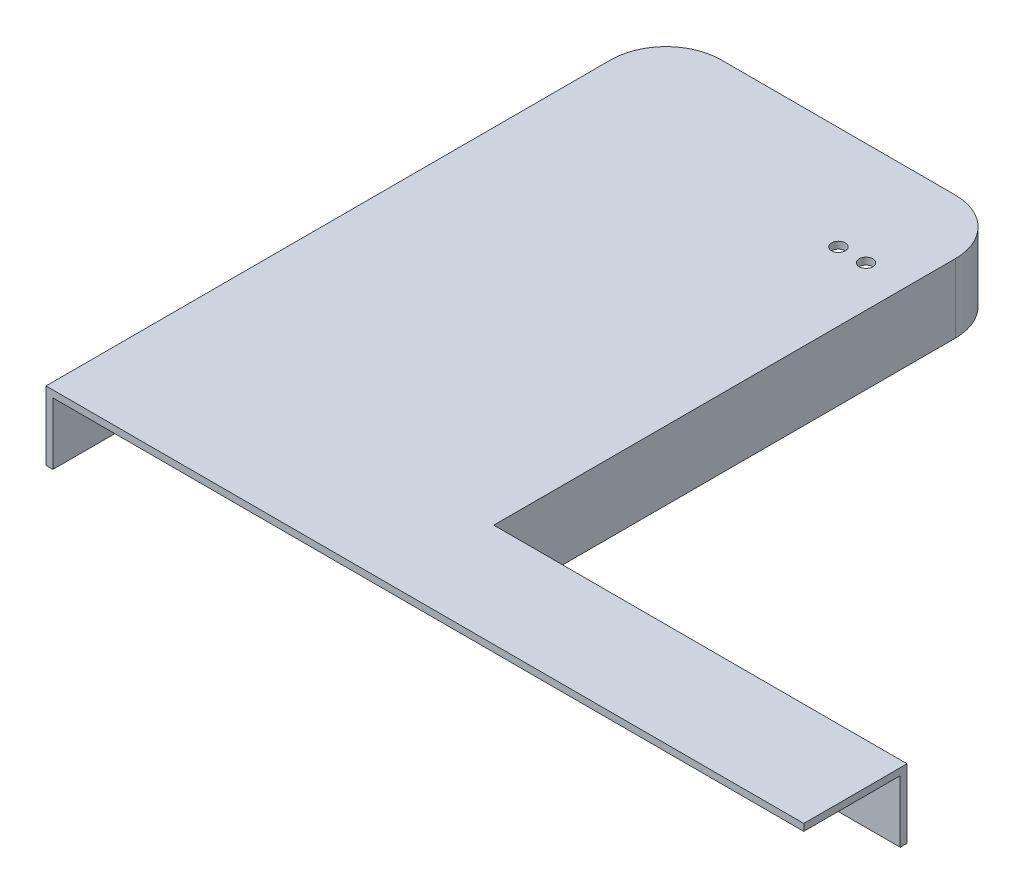
ISO-10303-21;
HEADER;
FILE_DESCRIPTION(('STEP AP214'),'2;1');
FILE_NAME('part.step','',(''),(''),'','','');
FILE_SCHEMA(('AUTOMOTIVE_DESIGN { 1 0 10303 214 1 1 1 1 }'));
ENDSEC;
DATA;
#1=APPLICATION_CONTEXT('core data for automotive mechanical design processes');
#2=APPLICATION_PROTOCOL_DEFINITION('international standard','automotive_design',2000,#1);
#3=PRODUCT_CONTEXT('',#1,'mechanical');
#4=PRODUCT('Part','Part','',(#3));
#5=PRODUCT_RELATED_PRODUCT_CATEGORY('part','',(#4));
#6=PRODUCT_DEFINITION_FORMATION('','',#4);
#7=PRODUCT_DEFINITION_CONTEXT('part definition',#1,'design');
#8=PRODUCT_DEFINITION('design','',#6,#7);
#9=PRODUCT_DEFINITION_SHAPE('','',#8);
#10=(LENGTH_UNIT() NAMED_UNIT(*) SI_UNIT(.MILLI.,.METRE.));
#11=(NAMED_UNIT(*) PLANE_ANGLE_UNIT() SI_UNIT($,.RADIAN.));
#12=(NAMED_UNIT(*) SI_UNIT($,.STERADIAN.) SOLID_ANGLE_UNIT());
#13=UNCERTAINTY_MEASURE_WITH_UNIT(LENGTH_MEASURE(1.E-05),#10,'distance_accuracy_value','');
#14=(GEOMETRIC_REPRESENTATION_CONTEXT(3) GLOBAL_UNCERTAINTY_ASSIGNED_CONTEXT((#13)) GLOBAL_UNIT_ASSIGNED_CONTEXT((#10,
#11,#12)) REPRESENTATION_CONTEXT('',''));
#15=CARTESIAN_POINT('',(0.,0.,0.));
#16=DIRECTION('',(0.,0.,1.));
#17=DIRECTION('',(1.,0.,0.));
#18=AXIS2_PLACEMENT_3D('',#15,#16,#17);
#19=CARTESIAN_POINT('',(0.,25.4,-12.7));
#20=DIRECTION('',(0.,0.,-1.));
#21=DIRECTION('',(-1.,0.,0.));
#22=AXIS2_PLACEMENT_3D('',#19,#20,#21);
#23=PLANE('',#22);
#24=DIRECTION('',(1.,0.,0.));
#25=VECTOR('',#24,1.);
#26=CARTESIAN_POINT('',(0.,25.4,-12.7));
#27=LINE('',#26,#25);
#28=CARTESIAN_POINT('',(-152.4,25.4,-12.7));
#29=VERTEX_POINT('',#28);
#30=CARTESIAN_POINT('',(0.,25.4,-12.7));
#31=VERTEX_POINT('',#30);
#32=EDGE_CURVE('E169',#29,#31,#27,.T.);
#33=ORIENTED_EDGE('',*,*,#32,.T.);
#34=DIRECTION('',(0.,-1.,0.));
#35=VECTOR('',#34,1.);
#36=CARTESIAN_POINT('',(0.,25.4,-12.7));
#37=LINE('',#36,#35);
#38=CARTESIAN_POINT('',(0.,0.,-12.7));
#39=VERTEX_POINT('',#38);
#40=EDGE_CURVE('E322',#31,#39,#37,.T.);
#41=ORIENTED_EDGE('',*,*,#40,.T.);
#42=DIRECTION('',(1.,0.,0.));
#43=VECTOR('',#42,1.);
#44=CARTESIAN_POINT('',(0.,0.,-12.7));
#45=LINE('',#44,#43);
#46=CARTESIAN_POINT('',(-152.4,0.,-12.7));
#47=VERTEX_POINT('',#46);
#48=EDGE_CURVE('E280',#47,#39,#45,.T.);
#49=ORIENTED_EDGE('',*,*,#48,.F.);
#50=DIRECTION('',(0.,-1.,0.));
#51=VECTOR('',#50,1.);
#52=CARTESIAN_POINT('',(-152.4,25.4,-12.7));
#53=LINE('',#52,#51);
#54=EDGE_CURVE('E183',#29,#47,#53,.T.);
#55=ORIENTED_EDGE('',*,*,#54,.F.);
#56=EDGE_LOOP('',(#33,#41,#49,#55));
#57=FACE_BOUND('',#56,.T.);
#58=ADVANCED_FACE('F40',(#57),#23,.T.);
#59=CARTESIAN_POINT('',(0.,25.4,0.));
#60=DIRECTION('',(0.,1.,0.));
#61=DIRECTION('',(0.,0.,1.));
#62=AXIS2_PLACEMENT_3D('',#59,#60,#61);
#63=PLANE('',#62);
#64=DIRECTION('',(-1.,0.,0.));
#65=VECTOR('',#64,1.);
#66=CARTESIAN_POINT('',(0.,25.4,25.4));
#67=LINE('',#66,#65);
#68=CARTESIAN_POINT('',(0.,25.4,25.4));
#69=VERTEX_POINT('',#68);
#70=CARTESIAN_POINT('',(-279.4,25.4,25.4));
#71=VERTEX_POINT('',#70);
#72=EDGE_CURVE('E152',#69,#71,#67,.T.);
#73=ORIENTED_EDGE('',*,*,#72,.F.);
#74=DIRECTION('',(0.,0.,1.));
#75=VECTOR('',#74,1.);
#76=CARTESIAN_POINT('',(0.,25.4,203.2));
#77=LINE('',#76,#75);
#78=EDGE_CURVE('E239',#31,#69,#77,.T.);
#79=ORIENTED_EDGE('',*,*,#78,.F.);
#80=ORIENTED_EDGE('',*,*,#32,.F.);
#81=DIRECTION('',(0.,0.,1.));
#82=VECTOR('',#81,1.);
#83=CARTESIAN_POINT('',(-152.4,25.4,0.));
#84=LINE('',#83,#82);
#85=CARTESIAN_POINT('',(-152.4,25.4,-182.88));
#86=VERTEX_POINT('',#85);
#87=EDGE_CURVE('E175',#86,#29,#84,.T.);
#88=ORIENTED_EDGE('',*,*,#87,.F.);
#89=CARTESIAN_POINT('',(-172.72,25.4,-182.88));
#90=DIRECTION('',(0.,1.,0.));
#91=DIRECTION('',(0.,0.,1.));
#92=AXIS2_PLACEMENT_3D('',#89,#90,#91);
#93=CIRCLE('',#92,20.32);
#94=CARTESIAN_POINT('',(-172.72,25.4,-203.2));
#95=VERTEX_POINT('',#94);
#96=EDGE_CURVE('E193',#86,#95,#93,.T.);
#97=ORIENTED_EDGE('',*,*,#96,.T.);
#98=DIRECTION('',(1.,0.,0.));
#99=VECTOR('',#98,1.);
#100=CARTESIAN_POINT('',(0.,25.4,-203.2));
#101=LINE('',#100,#99);
#102=CARTESIAN_POINT('',(-259.08,25.4,-203.2));
#103=VERTEX_POINT('',#102);
#104=EDGE_CURVE('E302',#103,#95,#101,.T.);
#105=ORIENTED_EDGE('',*,*,#104,.F.);
#106=CARTESIAN_POINT('',(-259.08,25.4,-182.88));
#107=DIRECTION('',(0.,1.,0.));
#108=DIRECTION('',(0.,0.,1.));
#109=AXIS2_PLACEMENT_3D('',#106,#107,#108);
#110=CIRCLE('',#109,20.32);
#111=CARTESIAN_POINT('',(-279.4,25.4,-182.88));
#112=VERTEX_POINT('',#111);
#113=EDGE_CURVE('E196',#103,#112,#110,.T.);
#114=ORIENTED_EDGE('',*,*,#113,.T.);
#115=DIRECTION('',(0.,0.,-1.));
#116=VECTOR('',#115,1.);
#117=CARTESIAN_POINT('',(-279.4,25.4,0.));
#118=LINE('',#117,#116);
#119=EDGE_CURVE('E63',#71,#112,#118,.T.);
#120=ORIENTED_EDGE('',*,*,#119,.F.);
#121=EDGE_LOOP('',(#73,#79,#80,#88,#97,#105,#114,#120));
#122=FACE_BOUND('',#121,.T.);
#123=CARTESIAN_POINT('',(-167.56,25.4,-165.1));
#124=DIRECTION('',(0.,1.,0.));
#125=DIRECTION('',(0.,0.,1.));
#126=AXIS2_PLACEMENT_3D('',#123,#124,#125);
#127=CIRCLE('',#126,2.53999999999998);
#128=CARTESIAN_POINT('',(-167.56,25.4,-162.56));
#129=VERTEX_POINT('',#128);
#130=EDGE_CURVE('E255',#129,#129,#127,.T.);
#131=ORIENTED_EDGE('',*,*,#130,.F.);
#132=EDGE_LOOP('',(#131));
#133=FACE_BOUND('',#132,.T.);
#134=CARTESIAN_POINT('',(-177.72,25.4,-165.1));
#135=DIRECTION('',(0.,1.,0.));
#136=DIRECTION('',(0.,0.,1.));
#137=AXIS2_PLACEMENT_3D('',#134,#135,#136);
#138=CIRCLE('',#137,2.53999999999998);
#139=CARTESIAN_POINT('',(-177.72,25.4,-162.56));
#140=VERTEX_POINT('',#139);
#141=EDGE_CURVE('E216',#140,#140,#138,.T.);
#142=ORIENTED_EDGE('',*,*,#141,.F.);
#143=EDGE_LOOP('',(#142));
#144=FACE_BOUND('',#143,.T.);
#145=ADVANCED_FACE('F337',(#122,#133,#144),#63,.T.);
#146=CARTESIAN_POINT('',(0.,0.,0.));
#147=DIRECTION('',(0.,1.,0.));
#148=DIRECTION('',(0.,0.,1.));
#149=AXIS2_PLACEMENT_3D('',#146,#147,#148);
#150=PLANE('',#149);
#151=DIRECTION('',(0.,0.,-1.));
#152=VECTOR('',#151,1.);
#153=CARTESIAN_POINT('',(-276.86,0.,0.));
#154=LINE('',#153,#152);
#155=CARTESIAN_POINT('',(-276.86,0.,25.4));
#156=VERTEX_POINT('',#155);
#157=CARTESIAN_POINT('',(-276.86,0.,-182.88));
#158=VERTEX_POINT('',#157);
#159=EDGE_CURVE('E162',#156,#158,#154,.T.);
#160=ORIENTED_EDGE('',*,*,#159,.F.);
#161=DIRECTION('',(1.,0.,0.));
#162=VECTOR('',#161,1.);
#163=CARTESIAN_POINT('',(-279.4,0.,25.4));
#164=LINE('',#163,#162);
#165=CARTESIAN_POINT('',(-279.4,0.,25.4));
#166=VERTEX_POINT('',#165);
#167=EDGE_CURVE('E149',#166,#156,#164,.T.);
#168=ORIENTED_EDGE('',*,*,#167,.F.);
#169=DIRECTION('',(0.,0.,-1.));
#170=VECTOR('',#169,1.);
#171=CARTESIAN_POINT('',(-279.4,0.,0.));
#172=LINE('',#171,#170);
#173=CARTESIAN_POINT('',(-279.4,0.,-182.88));
#174=VERTEX_POINT('',#173);
#175=EDGE_CURVE('E159',#166,#174,#172,.T.);
#176=ORIENTED_EDGE('',*,*,#175,.T.);
#177=CARTESIAN_POINT('',(-259.08,0.,-182.88));
#178=DIRECTION('',(0.,1.,0.));
#179=DIRECTION('',(0.,0.,1.));
#180=AXIS2_PLACEMENT_3D('',#177,#178,#179);
#181=CIRCLE('',#180,20.32);
#182=CARTESIAN_POINT('',(-259.08,0.,-203.2));
#183=VERTEX_POINT('',#182);
#184=EDGE_CURVE('E190',#174,#183,#181,.F.);
#185=ORIENTED_EDGE('',*,*,#184,.T.);
#186=DIRECTION('',(1.,0.,0.));
#187=VECTOR('',#186,1.);
#188=CARTESIAN_POINT('',(0.,0.,-203.2));
#189=LINE('',#188,#187);
#190=CARTESIAN_POINT('',(-172.72,0.,-203.2));
#191=VERTEX_POINT('',#190);
#192=EDGE_CURVE('E170',#183,#191,#189,.T.);
#193=ORIENTED_EDGE('',*,*,#192,.T.);
#194=CARTESIAN_POINT('',(-172.72,0.,-182.88));
#195=DIRECTION('',(0.,1.,0.));
#196=DIRECTION('',(0.,0.,1.));
#197=AXIS2_PLACEMENT_3D('',#194,#195,#196);
#198=CIRCLE('',#197,20.32);
#199=CARTESIAN_POINT('',(-152.4,0.,-182.88));
#200=VERTEX_POINT('',#199);
#201=EDGE_CURVE('E187',#191,#200,#198,.F.);
#202=ORIENTED_EDGE('',*,*,#201,.T.);
#203=DIRECTION('',(0.,0.,1.));
#204=VECTOR('',#203,1.);
#205=CARTESIAN_POINT('',(-152.4,0.,0.));
#206=LINE('',#205,#204);
#207=EDGE_CURVE('E178',#200,#47,#206,.T.);
#208=ORIENTED_EDGE('',*,*,#207,.T.);
#209=ORIENTED_EDGE('',*,*,#48,.T.);
#210=DIRECTION('',(0.,0.,-1.));
#211=VECTOR('',#210,1.);
#212=CARTESIAN_POINT('',(0.,0.,0.));
#213=LINE('',#212,#211);
#214=CARTESIAN_POINT('',(0.,0.,-10.16));
#215=VERTEX_POINT('',#214);
#216=EDGE_CURVE('E238',#215,#39,#213,.T.);
#217=ORIENTED_EDGE('',*,*,#216,.F.);
#218=DIRECTION('',(1.,0.,0.));
#219=VECTOR('',#218,1.);
#220=CARTESIAN_POINT('',(0.,0.,-10.16));
#221=LINE('',#220,#219);
#222=CARTESIAN_POINT('',(-154.94,0.,-10.16));
#223=VERTEX_POINT('',#222);
#224=EDGE_CURVE('E219',#223,#215,#221,.T.);
#225=ORIENTED_EDGE('',*,*,#224,.F.);
#226=DIRECTION('',(0.,0.,1.));
#227=VECTOR('',#226,1.);
#228=CARTESIAN_POINT('',(-154.94,0.,0.));
#229=LINE('',#228,#227);
#230=CARTESIAN_POINT('',(-154.94,0.,-182.88));
#231=VERTEX_POINT('',#230);
#232=EDGE_CURVE('E295',#231,#223,#229,.T.);
#233=ORIENTED_EDGE('',*,*,#232,.F.);
#234=CARTESIAN_POINT('',(-172.72,0.,-182.88));
#235=DIRECTION('',(0.,1.,0.));
#236=DIRECTION('',(0.,0.,1.));
#237=AXIS2_PLACEMENT_3D('',#234,#235,#236);
#238=CIRCLE('',#237,17.78);
#239=CARTESIAN_POINT('',(-172.72,0.,-200.66));
#240=VERTEX_POINT('',#239);
#241=EDGE_CURVE('E276',#240,#231,#238,.F.);
#242=ORIENTED_EDGE('',*,*,#241,.F.);
#243=DIRECTION('',(1.,0.,0.));
#244=VECTOR('',#243,1.);
#245=CARTESIAN_POINT('',(0.,0.,-200.66));
#246=LINE('',#245,#244);
#247=CARTESIAN_POINT('',(-259.08,0.,-200.66));
#248=VERTEX_POINT('',#247);
#249=EDGE_CURVE('E252',#248,#240,#246,.T.);
#250=ORIENTED_EDGE('',*,*,#249,.F.);
#251=CARTESIAN_POINT('',(-259.08,0.,-182.88));
#252=DIRECTION('',(0.,1.,0.));
#253=DIRECTION('',(0.,0.,1.));
#254=AXIS2_PLACEMENT_3D('',#251,#252,#253);
#255=CIRCLE('',#254,17.78);
#256=EDGE_CURVE('E262',#158,#248,#255,.F.);
#257=ORIENTED_EDGE('',*,*,#256,.F.);
#258=EDGE_LOOP('',(#160,#168,#176,#185,#193,#202,#208,#209,#217,#225,#233,#242,#250,#257));
#259=FACE_BOUND('',#258,.T.);
#260=ADVANCED_FACE('F158',(#259),#150,.F.);
#261=CARTESIAN_POINT('',(0.,25.4,-10.16));
#262=DIRECTION('',(0.,0.,-1.));
#263=DIRECTION('',(-1.,0.,0.));
#264=AXIS2_PLACEMENT_3D('',#261,#262,#263);
#265=PLANE('',#264);
#266=DIRECTION('',(0.,-1.,0.));
#267=VECTOR('',#266,1.);
#268=CARTESIAN_POINT('',(0.,25.4,-10.16));
#269=LINE('',#268,#267);
#270=CARTESIAN_POINT('',(0.,22.86,-10.16));
#271=VERTEX_POINT('',#270);
#272=EDGE_CURVE('E225',#271,#215,#269,.T.);
#273=ORIENTED_EDGE('',*,*,#272,.F.);
#274=DIRECTION('',(1.,0.,0.));
#275=VECTOR('',#274,1.);
#276=CARTESIAN_POINT('',(0.,22.86,-10.16));
#277=LINE('',#276,#275);
#278=CARTESIAN_POINT('',(-154.94,22.86,-10.16));
#279=VERTEX_POINT('',#278);
#280=EDGE_CURVE('E235',#279,#271,#277,.T.);
#281=ORIENTED_EDGE('',*,*,#280,.F.);
#282=DIRECTION('',(0.,-1.,0.));
#283=VECTOR('',#282,1.);
#284=CARTESIAN_POINT('',(-154.94,25.4,-10.16));
#285=LINE('',#284,#283);
#286=EDGE_CURVE('E273',#279,#223,#285,.T.);
#287=ORIENTED_EDGE('',*,*,#286,.T.);
#288=ORIENTED_EDGE('',*,*,#224,.T.);
#289=EDGE_LOOP('',(#273,#281,#287,#288));
#290=FACE_BOUND('',#289,.T.);
#291=ADVANCED_FACE('F233',(#290),#265,.F.);
#292=CARTESIAN_POINT('',(0.,22.86,0.));
#293=DIRECTION('',(0.,1.,0.));
#294=DIRECTION('',(0.,0.,1.));
#295=AXIS2_PLACEMENT_3D('',#292,#293,#294);
#296=PLANE('',#295);
#297=CARTESIAN_POINT('',(-167.56,22.86,-165.1));
#298=DIRECTION('',(0.,1.,0.));
#299=DIRECTION('',(0.,0.,1.));
#300=AXIS2_PLACEMENT_3D('',#297,#298,#299);
#301=CIRCLE('',#300,2.53999999999998);
#302=CARTESIAN_POINT('',(-167.56,22.86,-162.56));
#303=VERTEX_POINT('',#302);
#304=EDGE_CURVE('E211',#303,#303,#301,.T.);
#305=ORIENTED_EDGE('',*,*,#304,.T.);
#306=EDGE_LOOP('',(#305));
#307=FACE_BOUND('',#306,.T.);
#308=CARTESIAN_POINT('',(-177.72,22.86,-165.1));
#309=DIRECTION('',(0.,1.,0.));
#310=DIRECTION('',(0.,0.,1.));
#311=AXIS2_PLACEMENT_3D('',#308,#309,#310);
#312=CIRCLE('',#311,2.53999999999998);
#313=CARTESIAN_POINT('',(-177.72,22.86,-162.56));
#314=VERTEX_POINT('',#313);
#315=EDGE_CURVE('E215',#314,#314,#312,.T.);
#316=ORIENTED_EDGE('',*,*,#315,.T.);
#317=EDGE_LOOP('',(#316));
#318=FACE_BOUND('',#317,.T.);
#319=DIRECTION('',(0.,0.,-1.));
#320=VECTOR('',#319,1.);
#321=CARTESIAN_POINT('',(0.,22.86,0.));
#322=LINE('',#321,#320);
#323=CARTESIAN_POINT('',(0.,22.86,25.4));
#324=VERTEX_POINT('',#323);
#325=EDGE_CURVE('E49',#324,#271,#322,.T.);
#326=ORIENTED_EDGE('',*,*,#325,.F.);
#327=DIRECTION('',(-1.,0.,0.));
#328=VECTOR('',#327,1.);
#329=CARTESIAN_POINT('',(0.,22.86,25.4));
#330=LINE('',#329,#328);
#331=CARTESIAN_POINT('',(-276.86,22.86,25.4));
#332=VERTEX_POINT('',#331);
#333=EDGE_CURVE('E55',#324,#332,#330,.T.);
#334=ORIENTED_EDGE('',*,*,#333,.T.);
#335=DIRECTION('',(0.,0.,-1.));
#336=VECTOR('',#335,1.);
#337=CARTESIAN_POINT('',(-276.86,22.86,0.));
#338=LINE('',#337,#336);
#339=CARTESIAN_POINT('',(-276.86,22.86,-182.88));
#340=VERTEX_POINT('',#339);
#341=EDGE_CURVE('E266',#332,#340,#338,.T.);
#342=ORIENTED_EDGE('',*,*,#341,.T.);
#343=CARTESIAN_POINT('',(-259.08,22.86,-182.88));
#344=DIRECTION('',(0.,1.,0.));
#345=DIRECTION('',(0.,0.,1.));
#346=AXIS2_PLACEMENT_3D('',#343,#344,#345);
#347=CIRCLE('',#346,17.78);
#348=CARTESIAN_POINT('',(-259.08,22.86,-200.66));
#349=VERTEX_POINT('',#348);
#350=EDGE_CURVE('E261',#349,#340,#347,.T.);
#351=ORIENTED_EDGE('',*,*,#350,.F.);
#352=DIRECTION('',(1.,0.,0.));
#353=VECTOR('',#352,1.);
#354=CARTESIAN_POINT('',(0.,22.86,-200.66));
#355=LINE('',#354,#353);
#356=CARTESIAN_POINT('',(-172.72,22.86,-200.66));
#357=VERTEX_POINT('',#356);
#358=EDGE_CURVE('E250',#349,#357,#355,.T.);
#359=ORIENTED_EDGE('',*,*,#358,.T.);
#360=CARTESIAN_POINT('',(-172.72,22.86,-182.88));
#361=DIRECTION('',(0.,1.,0.));
#362=DIRECTION('',(0.,0.,1.));
#363=AXIS2_PLACEMENT_3D('',#360,#361,#362);
#364=CIRCLE('',#363,17.78);
#365=CARTESIAN_POINT('',(-154.94,22.86,-182.88));
#366=VERTEX_POINT('',#365);
#367=EDGE_CURVE('E258',#366,#357,#364,.T.);
#368=ORIENTED_EDGE('',*,*,#367,.F.);
#369=DIRECTION('',(0.,0.,1.));
#370=VECTOR('',#369,1.);
#371=CARTESIAN_POINT('',(-154.94,22.86,0.));
#372=LINE('',#371,#370);
#373=EDGE_CURVE('E244',#366,#279,#372,.T.);
#374=ORIENTED_EDGE('',*,*,#373,.T.);
#375=ORIENTED_EDGE('',*,*,#280,.T.);
#376=EDGE_LOOP('',(#326,#334,#342,#351,#359,#368,#374,#375));
#377=FACE_BOUND('',#376,.T.);
#378=ADVANCED_FACE('F241',(#307,#318,#377),#296,.F.);
#379=CARTESIAN_POINT('',(-152.4,25.4,0.));
#380=DIRECTION('',(1.,0.,0.));
#381=DIRECTION('',(0.,0.,-1.));
#382=AXIS2_PLACEMENT_3D('',#379,#380,#381);
#383=PLANE('',#382);
#384=ORIENTED_EDGE('',*,*,#207,.F.);
#385=DIRECTION('',(0.,-1.,0.));
#386=VECTOR('',#385,1.);
#387=CARTESIAN_POINT('',(-152.4,25.4,-182.88));
#388=LINE('',#387,#386);
#389=EDGE_CURVE('E208',#200,#86,#388,.F.);
#390=ORIENTED_EDGE('',*,*,#389,.T.);
#391=ORIENTED_EDGE('',*,*,#87,.T.);
#392=ORIENTED_EDGE('',*,*,#54,.T.);
#393=EDGE_LOOP('',(#384,#390,#391,#392));
#394=FACE_BOUND('',#393,.T.);
#395=ADVANCED_FACE('F317',(#394),#383,.T.);
#396=CARTESIAN_POINT('',(0.,25.4,-203.2));
#397=DIRECTION('',(0.,0.,-1.));
#398=DIRECTION('',(-1.,0.,0.));
#399=AXIS2_PLACEMENT_3D('',#396,#397,#398);
#400=PLANE('',#399);
#401=ORIENTED_EDGE('',*,*,#192,.F.);
#402=DIRECTION('',(0.,-1.,0.));
#403=VECTOR('',#402,1.);
#404=CARTESIAN_POINT('',(-259.08,25.4,-203.2));
#405=LINE('',#404,#403);
#406=EDGE_CURVE('E205',#183,#103,#405,.F.);
#407=ORIENTED_EDGE('',*,*,#406,.T.);
#408=ORIENTED_EDGE('',*,*,#104,.T.);
#409=DIRECTION('',(0.,-1.,0.));
#410=VECTOR('',#409,1.);
#411=CARTESIAN_POINT('',(-172.72,25.4,-203.2));
#412=LINE('',#411,#410);
#413=EDGE_CURVE('E201',#95,#191,#412,.T.);
#414=ORIENTED_EDGE('',*,*,#413,.T.);
#415=EDGE_LOOP('',(#401,#407,#408,#414));
#416=FACE_BOUND('',#415,.T.);
#417=ADVANCED_FACE('F356',(#416),#400,.T.);
#418=CARTESIAN_POINT('',(-279.4,25.4,0.));
#419=DIRECTION('',(-1.,0.,0.));
#420=DIRECTION('',(0.,0.,1.));
#421=AXIS2_PLACEMENT_3D('',#418,#419,#420);
#422=PLANE('',#421);
#423=DIRECTION('',(0.,-1.,0.));
#424=VECTOR('',#423,1.);
#425=CARTESIAN_POINT('',(-279.4,0.,25.4));
#426=LINE('',#425,#424);
#427=EDGE_CURVE('E146',#71,#166,#426,.T.);
#428=ORIENTED_EDGE('',*,*,#427,.F.);
#429=ORIENTED_EDGE('',*,*,#119,.T.);
#430=DIRECTION('',(0.,-1.,0.));
#431=VECTOR('',#430,1.);
#432=CARTESIAN_POINT('',(-279.4,25.4,-182.88));
#433=LINE('',#432,#431);
#434=EDGE_CURVE('E167',#112,#174,#433,.T.);
#435=ORIENTED_EDGE('',*,*,#434,.T.);
#436=ORIENTED_EDGE('',*,*,#175,.F.);
#437=EDGE_LOOP('',(#428,#429,#435,#436));
#438=FACE_BOUND('',#437,.T.);
#439=ADVANCED_FACE('F165',(#438),#422,.T.);
#440=CARTESIAN_POINT('',(-259.08,25.4,-182.88));
#441=DIRECTION('',(0.,-1.,0.));
#442=DIRECTION('',(0.,0.,-1.));
#443=AXIS2_PLACEMENT_3D('',#440,#441,#442);
#444=CYLINDRICAL_SURFACE('',#443,20.32);
#445=ORIENTED_EDGE('',*,*,#113,.F.);
#446=ORIENTED_EDGE('',*,*,#406,.F.);
#447=ORIENTED_EDGE('',*,*,#184,.F.);
#448=ORIENTED_EDGE('',*,*,#434,.F.);
#449=EDGE_LOOP('',(#445,#446,#447,#448));
#450=FACE_BOUND('',#449,.T.);
#451=ADVANCED_FACE('F355',(#450),#444,.T.);
#452=CARTESIAN_POINT('',(-172.72,25.4,-182.88));
#453=DIRECTION('',(0.,-1.,0.));
#454=DIRECTION('',(0.,0.,-1.));
#455=AXIS2_PLACEMENT_3D('',#452,#453,#454);
#456=CYLINDRICAL_SURFACE('',#455,20.32);
#457=ORIENTED_EDGE('',*,*,#96,.F.);
#458=ORIENTED_EDGE('',*,*,#389,.F.);
#459=ORIENTED_EDGE('',*,*,#201,.F.);
#460=ORIENTED_EDGE('',*,*,#413,.F.);
#461=EDGE_LOOP('',(#457,#458,#459,#460));
#462=FACE_BOUND('',#461,.T.);
#463=ADVANCED_FACE('F42',(#462),#456,.T.);
#464=CARTESIAN_POINT('',(-154.94,25.4,0.));
#465=DIRECTION('',(1.,0.,0.));
#466=DIRECTION('',(0.,0.,-1.));
#467=AXIS2_PLACEMENT_3D('',#464,#465,#466);
#468=PLANE('',#467);
#469=ORIENTED_EDGE('',*,*,#232,.T.);
#470=ORIENTED_EDGE('',*,*,#286,.F.);
#471=ORIENTED_EDGE('',*,*,#373,.F.);
#472=DIRECTION('',(0.,1.,0.));
#473=VECTOR('',#472,1.);
#474=CARTESIAN_POINT('',(-154.94,25.4,-182.88));
#475=LINE('',#474,#473);
#476=EDGE_CURVE('E277',#231,#366,#475,.T.);
#477=ORIENTED_EDGE('',*,*,#476,.F.);
#478=EDGE_LOOP('',(#469,#470,#471,#477));
#479=FACE_BOUND('',#478,.T.);
#480=ADVANCED_FACE('F367',(#479),#468,.F.);
#481=CARTESIAN_POINT('',(0.,25.4,-200.66));
#482=DIRECTION('',(0.,0.,-1.));
#483=DIRECTION('',(-1.,0.,0.));
#484=AXIS2_PLACEMENT_3D('',#481,#482,#483);
#485=PLANE('',#484);
#486=ORIENTED_EDGE('',*,*,#249,.T.);
#487=DIRECTION('',(0.,1.,0.));
#488=VECTOR('',#487,1.);
#489=CARTESIAN_POINT('',(-172.72,25.4,-200.66));
#490=LINE('',#489,#488);
#491=EDGE_CURVE('E282',#357,#240,#490,.F.);
#492=ORIENTED_EDGE('',*,*,#491,.F.);
#493=ORIENTED_EDGE('',*,*,#358,.F.);
#494=DIRECTION('',(0.,1.,0.));
#495=VECTOR('',#494,1.);
#496=CARTESIAN_POINT('',(-259.08,25.4,-200.66));
#497=LINE('',#496,#495);
#498=EDGE_CURVE('E281',#248,#349,#497,.T.);
#499=ORIENTED_EDGE('',*,*,#498,.F.);
#500=EDGE_LOOP('',(#486,#492,#493,#499));
#501=FACE_BOUND('',#500,.T.);
#502=ADVANCED_FACE('F397',(#501),#485,.F.);
#503=CARTESIAN_POINT('',(-276.86,25.4,0.));
#504=DIRECTION('',(-1.,0.,0.));
#505=DIRECTION('',(0.,0.,1.));
#506=AXIS2_PLACEMENT_3D('',#503,#504,#505);
#507=PLANE('',#506);
#508=ORIENTED_EDGE('',*,*,#341,.F.);
#509=DIRECTION('',(0.,-1.,0.));
#510=VECTOR('',#509,1.);
#511=CARTESIAN_POINT('',(-276.86,25.4,25.4));
#512=LINE('',#511,#510);
#513=EDGE_CURVE('E376',#332,#156,#512,.T.);
#514=ORIENTED_EDGE('',*,*,#513,.T.);
#515=ORIENTED_EDGE('',*,*,#159,.T.);
#516=DIRECTION('',(0.,1.,0.));
#517=VECTOR('',#516,1.);
#518=CARTESIAN_POINT('',(-276.86,25.4,-182.88));
#519=LINE('',#518,#517);
#520=EDGE_CURVE('E270',#340,#158,#519,.F.);
#521=ORIENTED_EDGE('',*,*,#520,.F.);
#522=EDGE_LOOP('',(#508,#514,#515,#521));
#523=FACE_BOUND('',#522,.T.);
#524=ADVANCED_FACE('F388',(#523),#507,.F.);
#525=CARTESIAN_POINT('',(-259.08,25.4,-182.88));
#526=DIRECTION('',(0.,-1.,0.));
#527=DIRECTION('',(0.,0.,-1.));
#528=AXIS2_PLACEMENT_3D('',#525,#526,#527);
#529=CYLINDRICAL_SURFACE('',#528,17.78);
#530=ORIENTED_EDGE('',*,*,#350,.T.);
#531=ORIENTED_EDGE('',*,*,#520,.T.);
#532=ORIENTED_EDGE('',*,*,#256,.T.);
#533=ORIENTED_EDGE('',*,*,#498,.T.);
#534=EDGE_LOOP('',(#530,#531,#532,#533));
#535=FACE_BOUND('',#534,.T.);
#536=ADVANCED_FACE('F390',(#535),#529,.F.);
#537=CARTESIAN_POINT('',(-172.72,25.4,-182.88));
#538=DIRECTION('',(0.,-1.,0.));
#539=DIRECTION('',(0.,0.,-1.));
#540=AXIS2_PLACEMENT_3D('',#537,#538,#539);
#541=CYLINDRICAL_SURFACE('',#540,17.78);
#542=ORIENTED_EDGE('',*,*,#367,.T.);
#543=ORIENTED_EDGE('',*,*,#491,.T.);
#544=ORIENTED_EDGE('',*,*,#241,.T.);
#545=ORIENTED_EDGE('',*,*,#476,.T.);
#546=EDGE_LOOP('',(#542,#543,#544,#545));
#547=FACE_BOUND('',#546,.T.);
#548=ADVANCED_FACE('F350',(#547),#541,.F.);
#549=CARTESIAN_POINT('',(-167.56,0.,-165.1));
#550=DIRECTION('',(0.,1.,0.));
#551=DIRECTION('',(0.,0.,1.));
#552=AXIS2_PLACEMENT_3D('',#549,#550,#551);
#553=CYLINDRICAL_SURFACE('',#552,2.53999999999998);
#554=ORIENTED_EDGE('',*,*,#130,.T.);
#555=EDGE_LOOP('',(#554));
#556=FACE_BOUND('',#555,.T.);
#557=ORIENTED_EDGE('',*,*,#304,.F.);
#558=EDGE_LOOP('',(#557));
#559=FACE_BOUND('',#558,.T.);
#560=ADVANCED_FACE('F419',(#556,#559),#553,.F.);
#561=CARTESIAN_POINT('',(-177.72,0.,-165.1));
#562=DIRECTION('',(0.,1.,0.));
#563=DIRECTION('',(0.,0.,1.));
#564=AXIS2_PLACEMENT_3D('',#561,#562,#563);
#565=CYLINDRICAL_SURFACE('',#564,2.53999999999998);
#566=ORIENTED_EDGE('',*,*,#141,.T.);
#567=EDGE_LOOP('',(#566));
#568=FACE_BOUND('',#567,.T.);
#569=ORIENTED_EDGE('',*,*,#315,.F.);
#570=EDGE_LOOP('',(#569));
#571=FACE_BOUND('',#570,.T.);
#572=ADVANCED_FACE('F334',(#568,#571),#565,.F.);
#573=CARTESIAN_POINT('',(0.,0.,0.));
#574=DIRECTION('',(1.,0.,0.));
#575=DIRECTION('',(0.,0.,-1.));
#576=AXIS2_PLACEMENT_3D('',#573,#574,#575);
#577=PLANE('',#576);
#578=DIRECTION('',(0.,1.,0.));
#579=VECTOR('',#578,1.);
#580=CARTESIAN_POINT('',(0.,0.,25.4));
#581=LINE('',#580,#579);
#582=EDGE_CURVE('E11',#324,#69,#581,.T.);
#583=ORIENTED_EDGE('',*,*,#582,.F.);
#584=ORIENTED_EDGE('',*,*,#325,.T.);
#585=ORIENTED_EDGE('',*,*,#272,.T.);
#586=ORIENTED_EDGE('',*,*,#216,.T.);
#587=ORIENTED_EDGE('',*,*,#40,.F.);
#588=ORIENTED_EDGE('',*,*,#78,.T.);
#589=EDGE_LOOP('',(#583,#584,#585,#586,#587,#588));
#590=FACE_BOUND('',#589,.T.);
#591=ADVANCED_FACE('F224',(#590),#577,.T.);
#592=CARTESIAN_POINT('',(0.,0.,25.4));
#593=DIRECTION('',(0.,0.,-1.));
#594=DIRECTION('',(-1.,0.,0.));
#595=AXIS2_PLACEMENT_3D('',#592,#593,#594);
#596=PLANE('',#595);
#597=ORIENTED_EDGE('',*,*,#333,.F.);
#598=ORIENTED_EDGE('',*,*,#582,.T.);
#599=ORIENTED_EDGE('',*,*,#72,.T.);
#600=ORIENTED_EDGE('',*,*,#427,.T.);
#601=ORIENTED_EDGE('',*,*,#167,.T.);
#602=ORIENTED_EDGE('',*,*,#513,.F.);
#603=EDGE_LOOP('',(#597,#598,#599,#600,#601,#602));
#604=FACE_BOUND('',#603,.T.);
#605=ADVANCED_FACE('F148',(#604),#596,.F.);
#606=CLOSED_SHELL('',(#58,#145,#260,#291,#378,#395,#417,#439,#451,#463,#480,#502,#524,#536,#548,
#560,#572,#591,#605));
#607=MANIFOLD_SOLID_BREP('B2',#606);
#608=ADVANCED_BREP_SHAPE_REPRESENTATION('',(#18,#607),#14);
#609=SHAPE_DEFINITION_REPRESENTATION(#9,#608);
ENDSEC;
END-ISO-10303-21;
